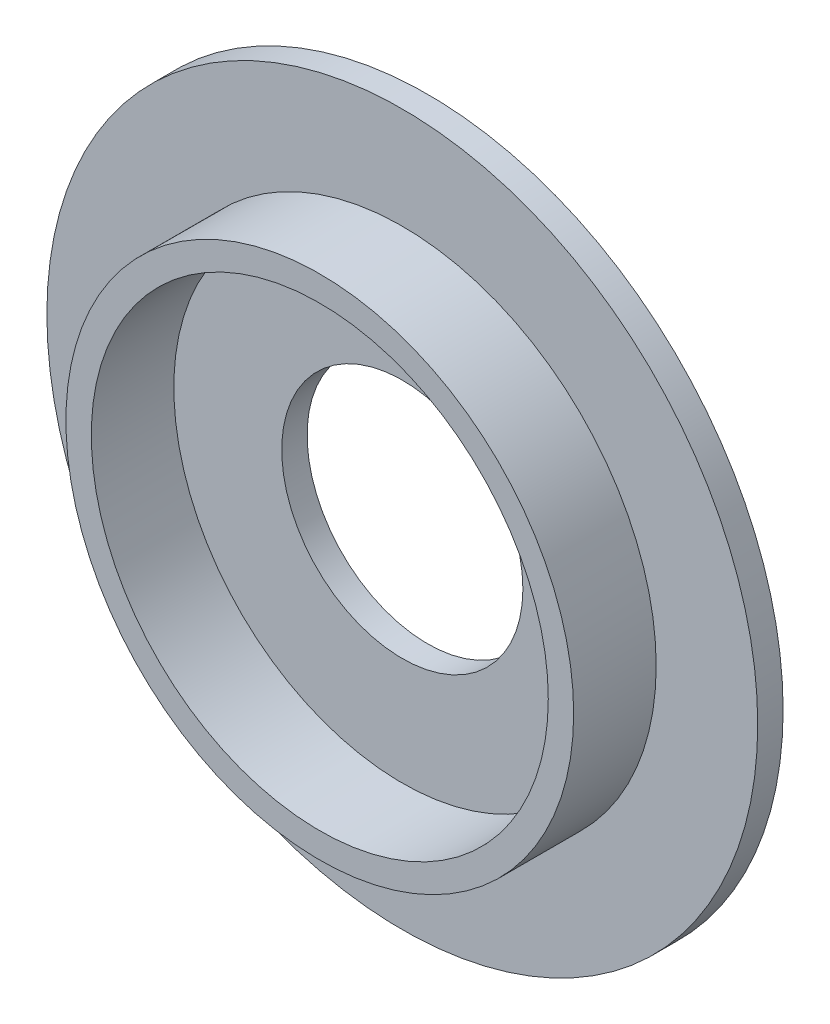
ISO-10303-21;
HEADER;
FILE_DESCRIPTION(('STEP AP214'),'2;1');
FILE_NAME('part.step','',(''),(''),'','','');
FILE_SCHEMA(('AUTOMOTIVE_DESIGN { 1 0 10303 214 1 1 1 1 }'));
ENDSEC;
DATA;
#1=APPLICATION_CONTEXT('core data for automotive mechanical design processes');
#2=APPLICATION_PROTOCOL_DEFINITION('international standard','automotive_design',2000,#1);
#3=PRODUCT_CONTEXT('',#1,'mechanical');
#4=PRODUCT('Part','Part','',(#3));
#5=PRODUCT_RELATED_PRODUCT_CATEGORY('part','',(#4));
#6=PRODUCT_DEFINITION_FORMATION('','',#4);
#7=PRODUCT_DEFINITION_CONTEXT('part definition',#1,'design');
#8=PRODUCT_DEFINITION('design','',#6,#7);
#9=PRODUCT_DEFINITION_SHAPE('','',#8);
#10=(LENGTH_UNIT() NAMED_UNIT(*) SI_UNIT(.MILLI.,.METRE.));
#11=(NAMED_UNIT(*) PLANE_ANGLE_UNIT() SI_UNIT($,.RADIAN.));
#12=(NAMED_UNIT(*) SI_UNIT($,.STERADIAN.) SOLID_ANGLE_UNIT());
#13=UNCERTAINTY_MEASURE_WITH_UNIT(LENGTH_MEASURE(1.E-05),#10,'distance_accuracy_value','');
#14=(GEOMETRIC_REPRESENTATION_CONTEXT(3) GLOBAL_UNCERTAINTY_ASSIGNED_CONTEXT((#13)) GLOBAL_UNIT_ASSIGNED_CONTEXT((#10,
#11,#12)) REPRESENTATION_CONTEXT('',''));
#15=CARTESIAN_POINT('',(0.,0.,0.));
#16=DIRECTION('',(0.,0.,1.));
#17=DIRECTION('',(1.,0.,0.));
#18=AXIS2_PLACEMENT_3D('',#15,#16,#17);
#19=CARTESIAN_POINT('',(0.,0.,10.));
#20=DIRECTION('',(0.,0.,1.));
#21=DIRECTION('',(1.,0.,0.));
#22=AXIS2_PLACEMENT_3D('',#19,#20,#21);
#23=PLANE('',#22);
#24=CARTESIAN_POINT('',(0.,0.,10.));
#25=DIRECTION('',(0.,0.,1.));
#26=DIRECTION('',(1.,0.,0.));
#27=AXIS2_PLACEMENT_3D('',#24,#25,#26);
#28=CIRCLE('',#27,140.);
#29=CARTESIAN_POINT('',(140.,0.,10.));
#30=VERTEX_POINT('',#29);
#31=EDGE_CURVE('E49',#30,#30,#28,.T.);
#32=ORIENTED_EDGE('',*,*,#31,.T.);
#33=EDGE_LOOP('',(#32));
#34=FACE_BOUND('',#33,.T.);
#35=CARTESIAN_POINT('',(0.,0.,10.));
#36=DIRECTION('',(0.,0.,1.));
#37=DIRECTION('',(1.,0.,0.));
#38=AXIS2_PLACEMENT_3D('',#35,#36,#37);
#39=CIRCLE('',#38,100.);
#40=CARTESIAN_POINT('',(100.,0.,10.));
#41=VERTEX_POINT('',#40);
#42=EDGE_CURVE('E70',#41,#41,#39,.T.);
#43=ORIENTED_EDGE('',*,*,#42,.F.);
#44=EDGE_LOOP('',(#43));
#45=FACE_BOUND('',#44,.T.);
#46=ADVANCED_FACE('F41',(#34,#45),#23,.T.);
#47=CARTESIAN_POINT('',(0.,0.,10.));
#48=DIRECTION('',(0.,0.,1.));
#49=DIRECTION('',(1.,0.,0.));
#50=AXIS2_PLACEMENT_3D('',#47,#48,#49);
#51=CIRCLE('',#50,90.);
#52=CARTESIAN_POINT('',(90.,0.,10.));
#53=VERTEX_POINT('',#52);
#54=EDGE_CURVE('E10',#53,#53,#51,.F.);
#55=ORIENTED_EDGE('',*,*,#54,.F.);
#56=EDGE_LOOP('',(#55));
#57=FACE_BOUND('',#56,.T.);
#58=CARTESIAN_POINT('',(0.,0.,10.));
#59=DIRECTION('',(0.,0.,1.));
#60=DIRECTION('',(1.,0.,0.));
#61=AXIS2_PLACEMENT_3D('',#58,#59,#60);
#62=CIRCLE('',#61,47.5);
#63=CARTESIAN_POINT('',(47.5,0.,10.));
#64=VERTEX_POINT('',#63);
#65=EDGE_CURVE('E60',#64,#64,#62,.T.);
#66=ORIENTED_EDGE('',*,*,#65,.F.);
#67=EDGE_LOOP('',(#66));
#68=FACE_BOUND('',#67,.T.);
#69=ADVANCED_FACE('F100',(#57,#68),#23,.T.);
#70=CARTESIAN_POINT('',(0.,0.,0.));
#71=DIRECTION('',(0.,0.,1.));
#72=DIRECTION('',(1.,0.,0.));
#73=AXIS2_PLACEMENT_3D('',#70,#71,#72);
#74=PLANE('',#73);
#75=CARTESIAN_POINT('',(0.,0.,0.));
#76=DIRECTION('',(0.,0.,1.));
#77=DIRECTION('',(1.,0.,0.));
#78=AXIS2_PLACEMENT_3D('',#75,#76,#77);
#79=CIRCLE('',#78,140.);
#80=CARTESIAN_POINT('',(140.,0.,0.));
#81=VERTEX_POINT('',#80);
#82=EDGE_CURVE('E54',#81,#81,#79,.T.);
#83=ORIENTED_EDGE('',*,*,#82,.F.);
#84=EDGE_LOOP('',(#83));
#85=FACE_BOUND('',#84,.T.);
#86=CARTESIAN_POINT('',(0.,0.,0.));
#87=DIRECTION('',(0.,0.,1.));
#88=DIRECTION('',(1.,0.,0.));
#89=AXIS2_PLACEMENT_3D('',#86,#87,#88);
#90=CIRCLE('',#89,47.5);
#91=CARTESIAN_POINT('',(47.5,0.,0.));
#92=VERTEX_POINT('',#91);
#93=EDGE_CURVE('E62',#92,#92,#90,.T.);
#94=ORIENTED_EDGE('',*,*,#93,.T.);
#95=EDGE_LOOP('',(#94));
#96=FACE_BOUND('',#95,.T.);
#97=ADVANCED_FACE('F105',(#85,#96),#74,.F.);
#98=CARTESIAN_POINT('',(0.,0.,10.));
#99=DIRECTION('',(0.,0.,-1.));
#100=DIRECTION('',(-1.,0.,0.));
#101=AXIS2_PLACEMENT_3D('',#98,#99,#100);
#102=CYLINDRICAL_SURFACE('',#101,140.);
#103=ORIENTED_EDGE('',*,*,#31,.F.);
#104=EDGE_LOOP('',(#103));
#105=FACE_BOUND('',#104,.T.);
#106=ORIENTED_EDGE('',*,*,#82,.T.);
#107=EDGE_LOOP('',(#106));
#108=FACE_BOUND('',#107,.T.);
#109=ADVANCED_FACE('F43',(#105,#108),#102,.T.);
#110=CARTESIAN_POINT('',(0.,0.,10.));
#111=DIRECTION('',(0.,0.,-1.));
#112=DIRECTION('',(-1.,0.,0.));
#113=AXIS2_PLACEMENT_3D('',#110,#111,#112);
#114=CYLINDRICAL_SURFACE('',#113,47.5);
#115=ORIENTED_EDGE('',*,*,#65,.T.);
#116=EDGE_LOOP('',(#115));
#117=FACE_BOUND('',#116,.T.);
#118=ORIENTED_EDGE('',*,*,#93,.F.);
#119=EDGE_LOOP('',(#118));
#120=FACE_BOUND('',#119,.T.);
#121=ADVANCED_FACE('F87',(#117,#120),#114,.F.);
#122=CARTESIAN_POINT('',(0.,0.,42.5));
#123=DIRECTION('',(0.,0.,1.));
#124=DIRECTION('',(1.,0.,0.));
#125=AXIS2_PLACEMENT_3D('',#122,#123,#124);
#126=PLANE('',#125);
#127=CARTESIAN_POINT('',(0.,0.,42.5));
#128=DIRECTION('',(0.,0.,1.));
#129=DIRECTION('',(1.,0.,0.));
#130=AXIS2_PLACEMENT_3D('',#127,#128,#129);
#131=CIRCLE('',#130,100.);
#132=CARTESIAN_POINT('',(100.,0.,42.5));
#133=VERTEX_POINT('',#132);
#134=EDGE_CURVE('E66',#133,#133,#131,.T.);
#135=ORIENTED_EDGE('',*,*,#134,.T.);
#136=EDGE_LOOP('',(#135));
#137=FACE_BOUND('',#136,.T.);
#138=CARTESIAN_POINT('',(0.,0.,42.5));
#139=DIRECTION('',(0.,0.,1.));
#140=DIRECTION('',(1.,0.,0.));
#141=AXIS2_PLACEMENT_3D('',#138,#139,#140);
#142=CIRCLE('',#141,90.);
#143=CARTESIAN_POINT('',(90.,0.,42.5));
#144=VERTEX_POINT('',#143);
#145=EDGE_CURVE('E74',#144,#144,#142,.T.);
#146=ORIENTED_EDGE('',*,*,#145,.F.);
#147=EDGE_LOOP('',(#146));
#148=FACE_BOUND('',#147,.T.);
#149=ADVANCED_FACE('F84',(#137,#148),#126,.T.);
#150=CARTESIAN_POINT('',(0.,0.,42.5));
#151=DIRECTION('',(0.,0.,-1.));
#152=DIRECTION('',(-1.,0.,0.));
#153=AXIS2_PLACEMENT_3D('',#150,#151,#152);
#154=CYLINDRICAL_SURFACE('',#153,100.);
#155=ORIENTED_EDGE('',*,*,#134,.F.);
#156=EDGE_LOOP('',(#155));
#157=FACE_BOUND('',#156,.T.);
#158=ORIENTED_EDGE('',*,*,#42,.T.);
#159=EDGE_LOOP('',(#158));
#160=FACE_BOUND('',#159,.T.);
#161=ADVANCED_FACE('F86',(#157,#160),#154,.T.);
#162=CARTESIAN_POINT('',(0.,0.,42.5));
#163=DIRECTION('',(0.,0.,-1.));
#164=DIRECTION('',(-1.,0.,0.));
#165=AXIS2_PLACEMENT_3D('',#162,#163,#164);
#166=CYLINDRICAL_SURFACE('',#165,90.);
#167=ORIENTED_EDGE('',*,*,#145,.T.);
#168=EDGE_LOOP('',(#167));
#169=FACE_BOUND('',#168,.T.);
#170=ORIENTED_EDGE('',*,*,#54,.T.);
#171=EDGE_LOOP('',(#170));
#172=FACE_BOUND('',#171,.T.);
#173=ADVANCED_FACE('F82',(#169,#172),#166,.F.);
#174=CLOSED_SHELL('',(#46,#69,#97,#109,#121,#149,#161,#173));
#175=MANIFOLD_SOLID_BREP('B2',#174);
#176=ADVANCED_BREP_SHAPE_REPRESENTATION('',(#18,#175),#14);
#177=SHAPE_DEFINITION_REPRESENTATION(#9,#176);
ENDSEC;
END-ISO-10303-21;
